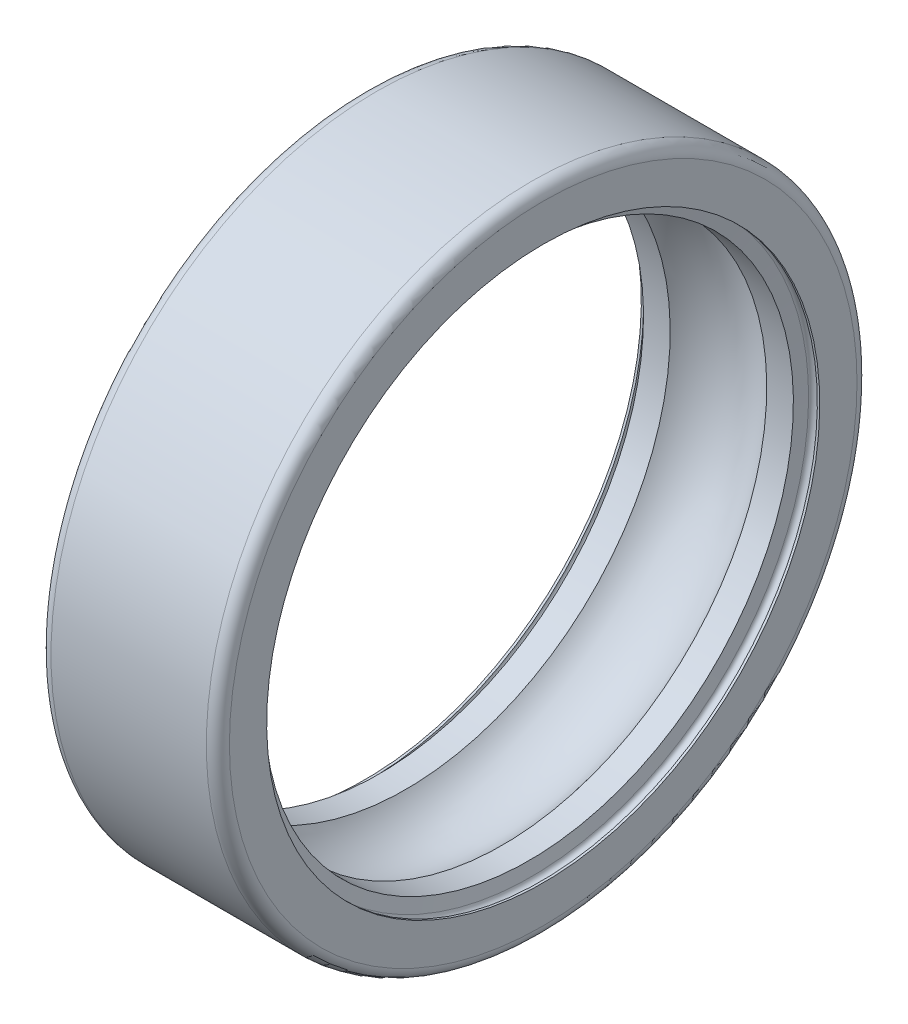
ISO-10303-21;
HEADER;
FILE_DESCRIPTION(('STEP AP214'),'2;1');
FILE_NAME('part.step','',(''),(''),'','','');
FILE_SCHEMA(('AUTOMOTIVE_DESIGN { 1 0 10303 214 1 1 1 1 }'));
ENDSEC;
DATA;
#1=APPLICATION_CONTEXT('core data for automotive mechanical design processes');
#2=APPLICATION_PROTOCOL_DEFINITION('international standard','automotive_design',2000,#1);
#3=PRODUCT_CONTEXT('',#1,'mechanical');
#4=PRODUCT('Part','Part','',(#3));
#5=PRODUCT_RELATED_PRODUCT_CATEGORY('part','',(#4));
#6=PRODUCT_DEFINITION_FORMATION('','',#4);
#7=PRODUCT_DEFINITION_CONTEXT('part definition',#1,'design');
#8=PRODUCT_DEFINITION('design','',#6,#7);
#9=PRODUCT_DEFINITION_SHAPE('','',#8);
#10=(LENGTH_UNIT() NAMED_UNIT(*) SI_UNIT(.MILLI.,.METRE.));
#11=(NAMED_UNIT(*) PLANE_ANGLE_UNIT() SI_UNIT($,.RADIAN.));
#12=(NAMED_UNIT(*) SI_UNIT($,.STERADIAN.) SOLID_ANGLE_UNIT());
#13=UNCERTAINTY_MEASURE_WITH_UNIT(LENGTH_MEASURE(1.E-05),#10,'distance_accuracy_value','');
#14=(GEOMETRIC_REPRESENTATION_CONTEXT(3) GLOBAL_UNCERTAINTY_ASSIGNED_CONTEXT((#13)) GLOBAL_UNIT_ASSIGNED_CONTEXT((#10,
#11,#12)) REPRESENTATION_CONTEXT('',''));
#15=CARTESIAN_POINT('',(0.,0.,0.));
#16=DIRECTION('',(0.,0.,1.));
#17=DIRECTION('',(1.,0.,0.));
#18=AXIS2_PLACEMENT_3D('',#15,#16,#17);
#19=CARTESIAN_POINT('',(16.31,0.,0.));
#20=DIRECTION('',(1.,0.,0.));
#21=DIRECTION('',(0.,0.,-1.));
#22=AXIS2_PLACEMENT_3D('',#19,#20,#21);
#23=TOROIDAL_SURFACE('',#22,26.35,0.46);
#24=CARTESIAN_POINT('',(16.77,0.,0.));
#25=DIRECTION('',(1.,0.,0.));
#26=DIRECTION('',(0.,1.,0.));
#27=AXIS2_PLACEMENT_3D('',#24,#25,#26);
#28=CIRCLE('',#27,26.35);
#29=CARTESIAN_POINT('',(16.77,26.35,0.));
#30=VERTEX_POINT('',#29);
#31=EDGE_CURVE('E11',#30,#30,#28,.T.);
#32=ORIENTED_EDGE('',*,*,#31,.T.);
#33=EDGE_LOOP('',(#32));
#34=FACE_BOUND('',#33,.T.);
#35=CARTESIAN_POINT('',(15.8569884336144,0.,0.));
#36=DIRECTION('',(1.,0.,0.));
#37=DIRECTION('',(0.,1.,0.));
#38=AXIS2_PLACEMENT_3D('',#35,#36,#37);
#39=CIRCLE('',#38,26.4298781617268);
#40=CARTESIAN_POINT('',(15.8569884336144,26.4298781617268,0.));
#41=VERTEX_POINT('',#40);
#42=EDGE_CURVE('E80',#41,#41,#39,.T.);
#43=ORIENTED_EDGE('',*,*,#42,.F.);
#44=EDGE_LOOP('',(#43));
#45=FACE_BOUND('',#44,.T.);
#46=ADVANCED_FACE('F17',(#34,#45),#23,.F.);
#47=CARTESIAN_POINT('',(16.885,0.,0.));
#48=DIRECTION('',(-1.,0.,0.));
#49=DIRECTION('',(0.,1.,0.));
#50=AXIS2_PLACEMENT_3D('',#47,#48,#49);
#51=CYLINDRICAL_SURFACE('',#50,26.35);
#52=CARTESIAN_POINT('',(17.,0.,0.));
#53=DIRECTION('',(1.,0.,0.));
#54=DIRECTION('',(0.,1.,0.));
#55=AXIS2_PLACEMENT_3D('',#52,#53,#54);
#56=CIRCLE('',#55,26.35);
#57=CARTESIAN_POINT('',(17.,26.35,0.));
#58=VERTEX_POINT('',#57);
#59=EDGE_CURVE('E28',#58,#58,#56,.T.);
#60=ORIENTED_EDGE('',*,*,#59,.T.);
#61=EDGE_LOOP('',(#60));
#62=FACE_BOUND('',#61,.T.);
#63=ORIENTED_EDGE('',*,*,#31,.F.);
#64=EDGE_LOOP('',(#63));
#65=FACE_BOUND('',#64,.T.);
#66=ADVANCED_FACE('F146',(#62,#65),#51,.F.);
#67=CARTESIAN_POINT('',(17.,28.125,0.));
#68=DIRECTION('',(1.,0.,0.));
#69=DIRECTION('',(0.,1.,0.));
#70=AXIS2_PLACEMENT_3D('',#67,#68,#69);
#71=PLANE('',#70);
#72=CARTESIAN_POINT('',(17.,0.,0.));
#73=DIRECTION('',(1.,0.,0.));
#74=DIRECTION('',(0.,1.,0.));
#75=AXIS2_PLACEMENT_3D('',#72,#73,#74);
#76=CIRCLE('',#75,29.9);
#77=CARTESIAN_POINT('',(17.,29.9,0.));
#78=VERTEX_POINT('',#77);
#79=EDGE_CURVE('E95',#78,#78,#76,.T.);
#80=ORIENTED_EDGE('',*,*,#79,.T.);
#81=EDGE_LOOP('',(#80));
#82=FACE_BOUND('',#81,.T.);
#83=ORIENTED_EDGE('',*,*,#59,.F.);
#84=EDGE_LOOP('',(#83));
#85=FACE_BOUND('',#84,.T.);
#86=ADVANCED_FACE('F152',(#82,#85),#71,.T.);
#87=CARTESIAN_POINT('',(15.9,0.,0.));
#88=DIRECTION('',(1.,0.,0.));
#89=DIRECTION('',(0.,0.,-1.));
#90=AXIS2_PLACEMENT_3D('',#87,#88,#89);
#91=TOROIDAL_SURFACE('',#90,29.9,1.1);
#92=CARTESIAN_POINT('',(15.9,0.,0.));
#93=DIRECTION('',(1.,0.,0.));
#94=DIRECTION('',(0.,1.,0.));
#95=AXIS2_PLACEMENT_3D('',#92,#93,#94);
#96=CIRCLE('',#95,31.);
#97=CARTESIAN_POINT('',(15.9,31.,0.));
#98=VERTEX_POINT('',#97);
#99=EDGE_CURVE('E21',#98,#98,#96,.T.);
#100=ORIENTED_EDGE('',*,*,#99,.T.);
#101=EDGE_LOOP('',(#100));
#102=FACE_BOUND('',#101,.T.);
#103=ORIENTED_EDGE('',*,*,#79,.F.);
#104=EDGE_LOOP('',(#103));
#105=FACE_BOUND('',#104,.T.);
#106=ADVANCED_FACE('F159',(#102,#105),#91,.T.);
#107=CARTESIAN_POINT('',(8.5,0.,0.));
#108=DIRECTION('',(-1.,0.,0.));
#109=DIRECTION('',(0.,1.,0.));
#110=AXIS2_PLACEMENT_3D('',#107,#108,#109);
#111=CYLINDRICAL_SURFACE('',#110,31.);
#112=CARTESIAN_POINT('',(1.1,0.,0.));
#113=DIRECTION('',(1.,0.,0.));
#114=DIRECTION('',(0.,1.,0.));
#115=AXIS2_PLACEMENT_3D('',#112,#113,#114);
#116=CIRCLE('',#115,31.);
#117=CARTESIAN_POINT('',(1.1,31.,0.));
#118=VERTEX_POINT('',#117);
#119=EDGE_CURVE('E118',#118,#118,#116,.T.);
#120=ORIENTED_EDGE('',*,*,#119,.T.);
#121=EDGE_LOOP('',(#120));
#122=FACE_BOUND('',#121,.T.);
#123=ORIENTED_EDGE('',*,*,#99,.F.);
#124=EDGE_LOOP('',(#123));
#125=FACE_BOUND('',#124,.T.);
#126=ADVANCED_FACE('F142',(#122,#125),#111,.T.);
#127=CARTESIAN_POINT('',(1.1,0.,0.));
#128=DIRECTION('',(1.,0.,0.));
#129=DIRECTION('',(0.,0.,-1.));
#130=AXIS2_PLACEMENT_3D('',#127,#128,#129);
#131=TOROIDAL_SURFACE('',#130,29.9,1.1);
#132=CARTESIAN_POINT('',(0.,0.,0.));
#133=DIRECTION('',(1.,0.,0.));
#134=DIRECTION('',(0.,1.,0.));
#135=AXIS2_PLACEMENT_3D('',#132,#133,#134);
#136=CIRCLE('',#135,29.9);
#137=CARTESIAN_POINT('',(0.,29.9,0.));
#138=VERTEX_POINT('',#137);
#139=EDGE_CURVE('E110',#138,#138,#136,.T.);
#140=ORIENTED_EDGE('',*,*,#139,.T.);
#141=EDGE_LOOP('',(#140));
#142=FACE_BOUND('',#141,.T.);
#143=ORIENTED_EDGE('',*,*,#119,.F.);
#144=EDGE_LOOP('',(#143));
#145=FACE_BOUND('',#144,.T.);
#146=ADVANCED_FACE('F125',(#142,#145),#131,.T.);
#147=CARTESIAN_POINT('',(0.,28.125,0.));
#148=DIRECTION('',(-1.,0.,0.));
#149=DIRECTION('',(0.,-1.,0.));
#150=AXIS2_PLACEMENT_3D('',#147,#148,#149);
#151=PLANE('',#150);
#152=CARTESIAN_POINT('',(0.,0.,0.));
#153=DIRECTION('',(1.,0.,0.));
#154=DIRECTION('',(0.,1.,0.));
#155=AXIS2_PLACEMENT_3D('',#152,#153,#154);
#156=CIRCLE('',#155,26.35);
#157=CARTESIAN_POINT('',(0.,26.35,0.));
#158=VERTEX_POINT('',#157);
#159=EDGE_CURVE('E107',#158,#158,#156,.T.);
#160=ORIENTED_EDGE('',*,*,#159,.T.);
#161=EDGE_LOOP('',(#160));
#162=FACE_BOUND('',#161,.T.);
#163=ORIENTED_EDGE('',*,*,#139,.F.);
#164=EDGE_LOOP('',(#163));
#165=FACE_BOUND('',#164,.T.);
#166=ADVANCED_FACE('F128',(#162,#165),#151,.T.);
#167=CARTESIAN_POINT('',(0.114999999999998,0.,0.));
#168=DIRECTION('',(-1.,0.,0.));
#169=DIRECTION('',(0.,1.,0.));
#170=AXIS2_PLACEMENT_3D('',#167,#168,#169);
#171=CYLINDRICAL_SURFACE('',#170,26.35);
#172=CARTESIAN_POINT('',(0.23,0.,0.));
#173=DIRECTION('',(1.,0.,0.));
#174=DIRECTION('',(0.,1.,0.));
#175=AXIS2_PLACEMENT_3D('',#172,#173,#174);
#176=CIRCLE('',#175,26.35);
#177=CARTESIAN_POINT('',(0.23,26.35,0.));
#178=VERTEX_POINT('',#177);
#179=EDGE_CURVE('E102',#178,#178,#176,.T.);
#180=ORIENTED_EDGE('',*,*,#179,.T.);
#181=EDGE_LOOP('',(#180));
#182=FACE_BOUND('',#181,.T.);
#183=ORIENTED_EDGE('',*,*,#159,.F.);
#184=EDGE_LOOP('',(#183));
#185=FACE_BOUND('',#184,.T.);
#186=ADVANCED_FACE('F130',(#182,#185),#171,.F.);
#187=CARTESIAN_POINT('',(0.69,0.,0.));
#188=DIRECTION('',(1.,0.,0.));
#189=DIRECTION('',(0.,0.,-1.));
#190=AXIS2_PLACEMENT_3D('',#187,#188,#189);
#191=TOROIDAL_SURFACE('',#190,26.35,0.46);
#192=CARTESIAN_POINT('',(1.14301156638562,0.,0.));
#193=DIRECTION('',(1.,0.,0.));
#194=DIRECTION('',(0.,1.,0.));
#195=AXIS2_PLACEMENT_3D('',#192,#193,#194);
#196=CIRCLE('',#195,26.4298781617268);
#197=CARTESIAN_POINT('',(1.14301156638562,26.4298781617268,0.));
#198=VERTEX_POINT('',#197);
#199=EDGE_CURVE('E98',#198,#198,#196,.T.);
#200=ORIENTED_EDGE('',*,*,#199,.T.);
#201=EDGE_LOOP('',(#200));
#202=FACE_BOUND('',#201,.T.);
#203=ORIENTED_EDGE('',*,*,#179,.F.);
#204=EDGE_LOOP('',(#203));
#205=FACE_BOUND('',#204,.T.);
#206=ADVANCED_FACE('F138',(#202,#205),#191,.F.);
#207=CARTESIAN_POINT('',(1.2514419178339,0.,0.));
#208=DIRECTION('',(-1.,0.,0.));
#209=DIRECTION('',(0.,1.,0.));
#210=AXIS2_PLACEMENT_3D('',#207,#208,#209);
#211=CONICAL_SURFACE('',#210,25.8149390808634,1.39626340159546);
#212=CARTESIAN_POINT('',(1.35987226928218,0.,0.));
#213=DIRECTION('',(1.,0.,0.));
#214=DIRECTION('',(0.,1.,0.));
#215=AXIS2_PLACEMENT_3D('',#212,#213,#214);
#216=CIRCLE('',#215,25.2);
#217=CARTESIAN_POINT('',(1.35987226928218,25.2,0.));
#218=VERTEX_POINT('',#217);
#219=EDGE_CURVE('E103',#218,#218,#216,.T.);
#220=ORIENTED_EDGE('',*,*,#219,.T.);
#221=EDGE_LOOP('',(#220));
#222=FACE_BOUND('',#221,.T.);
#223=ORIENTED_EDGE('',*,*,#199,.F.);
#224=EDGE_LOOP('',(#223));
#225=FACE_BOUND('',#224,.T.);
#226=ADVANCED_FACE('F165',(#222,#225),#211,.F.);
#227=CARTESIAN_POINT('',(2.62993613464109,0.,0.));
#228=DIRECTION('',(-1.,0.,0.));
#229=DIRECTION('',(0.,1.,0.));
#230=AXIS2_PLACEMENT_3D('',#227,#228,#229);
#231=CYLINDRICAL_SURFACE('',#230,25.2);
#232=CARTESIAN_POINT('',(3.9,0.,0.));
#233=DIRECTION('',(1.,0.,0.));
#234=DIRECTION('',(0.,1.,0.));
#235=AXIS2_PLACEMENT_3D('',#232,#233,#234);
#236=CIRCLE('',#235,25.2);
#237=CARTESIAN_POINT('',(3.9,25.2,0.));
#238=VERTEX_POINT('',#237);
#239=EDGE_CURVE('E106',#238,#238,#236,.T.);
#240=ORIENTED_EDGE('',*,*,#239,.T.);
#241=EDGE_LOOP('',(#240));
#242=FACE_BOUND('',#241,.T.);
#243=ORIENTED_EDGE('',*,*,#219,.F.);
#244=EDGE_LOOP('',(#243));
#245=FACE_BOUND('',#244,.T.);
#246=ADVANCED_FACE('F161',(#242,#245),#231,.F.);
#247=CARTESIAN_POINT('',(8.5,0.,0.));
#248=DIRECTION('',(1.,0.,0.));
#249=DIRECTION('',(0.,0.,-1.));
#250=AXIS2_PLACEMENT_3D('',#247,#248,#249);
#251=TOROIDAL_SURFACE('',#250,21.75,5.75);
#252=CARTESIAN_POINT('',(13.1,0.,0.));
#253=DIRECTION('',(1.,0.,0.));
#254=DIRECTION('',(0.,1.,0.));
#255=AXIS2_PLACEMENT_3D('',#252,#253,#254);
#256=CIRCLE('',#255,25.2);
#257=CARTESIAN_POINT('',(13.1,25.2,0.));
#258=VERTEX_POINT('',#257);
#259=EDGE_CURVE('E92',#258,#258,#256,.T.);
#260=ORIENTED_EDGE('',*,*,#259,.T.);
#261=EDGE_LOOP('',(#260));
#262=FACE_BOUND('',#261,.T.);
#263=ORIENTED_EDGE('',*,*,#239,.F.);
#264=EDGE_LOOP('',(#263));
#265=FACE_BOUND('',#264,.T.);
#266=ADVANCED_FACE('F164',(#262,#265),#251,.F.);
#267=CARTESIAN_POINT('',(14.3700638653589,0.,0.));
#268=DIRECTION('',(-1.,0.,0.));
#269=DIRECTION('',(0.,1.,0.));
#270=AXIS2_PLACEMENT_3D('',#267,#268,#269);
#271=CYLINDRICAL_SURFACE('',#270,25.2);
#272=CARTESIAN_POINT('',(15.6401277307178,0.,0.));
#273=DIRECTION('',(1.,0.,0.));
#274=DIRECTION('',(0.,1.,0.));
#275=AXIS2_PLACEMENT_3D('',#272,#273,#274);
#276=CIRCLE('',#275,25.2);
#277=CARTESIAN_POINT('',(15.6401277307178,25.2,0.));
#278=VERTEX_POINT('',#277);
#279=EDGE_CURVE('E84',#278,#278,#276,.T.);
#280=ORIENTED_EDGE('',*,*,#279,.T.);
#281=EDGE_LOOP('',(#280));
#282=FACE_BOUND('',#281,.T.);
#283=ORIENTED_EDGE('',*,*,#259,.F.);
#284=EDGE_LOOP('',(#283));
#285=FACE_BOUND('',#284,.T.);
#286=ADVANCED_FACE('F85',(#282,#285),#271,.F.);
#287=CARTESIAN_POINT('',(15.7485580821661,0.,0.));
#288=DIRECTION('',(1.,0.,0.));
#289=DIRECTION('',(0.,1.,0.));
#290=AXIS2_PLACEMENT_3D('',#287,#288,#289);
#291=CONICAL_SURFACE('',#290,25.8149390808634,1.39626340159546);
#292=ORIENTED_EDGE('',*,*,#42,.T.);
#293=EDGE_LOOP('',(#292));
#294=FACE_BOUND('',#293,.T.);
#295=ORIENTED_EDGE('',*,*,#279,.F.);
#296=EDGE_LOOP('',(#295));
#297=FACE_BOUND('',#296,.T.);
#298=ADVANCED_FACE('F19',(#294,#297),#291,.F.);
#299=CLOSED_SHELL('',(#46,#66,#86,#106,#126,#146,#166,#186,#206,#226,#246,#266,#286,#298));
#300=MANIFOLD_SOLID_BREP('B1',#299);
#301=ADVANCED_BREP_SHAPE_REPRESENTATION('',(#18,#300),#14);
#302=SHAPE_DEFINITION_REPRESENTATION(#9,#301);
ENDSEC;
END-ISO-10303-21;
